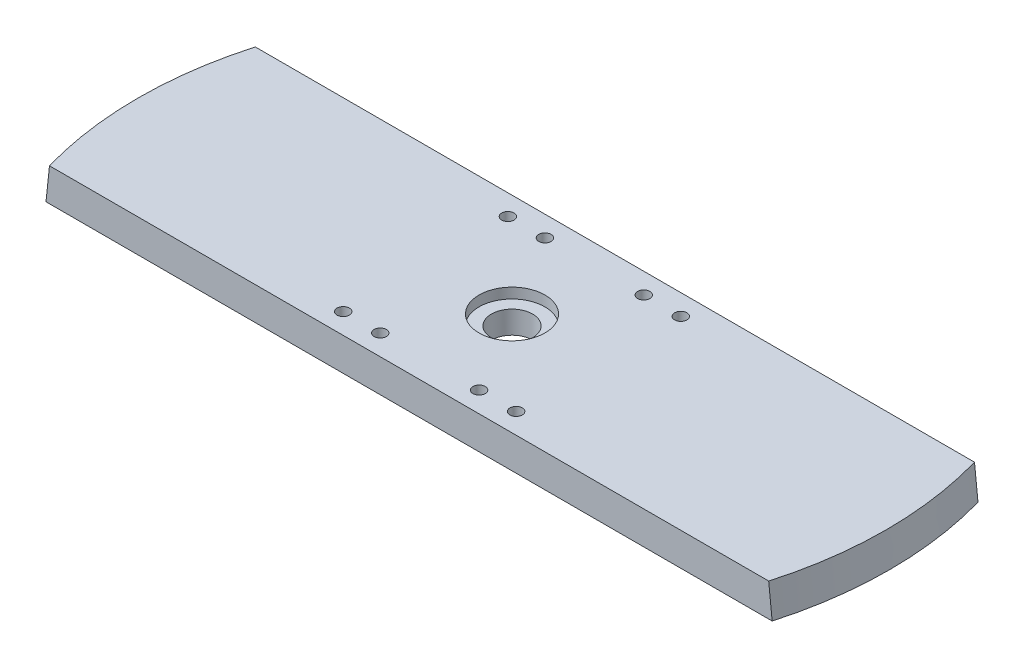
ISO-10303-21;
HEADER;
FILE_DESCRIPTION(('STEP AP214'),'2;1');
FILE_NAME('part.step','',(''),(''),'','','');
FILE_SCHEMA(('AUTOMOTIVE_DESIGN { 1 0 10303 214 1 1 1 1 }'));
ENDSEC;
DATA;
#1=APPLICATION_CONTEXT('core data for automotive mechanical design processes');
#2=APPLICATION_PROTOCOL_DEFINITION('international standard','automotive_design',2000,#1);
#3=PRODUCT_CONTEXT('',#1,'mechanical');
#4=PRODUCT('Part','Part','',(#3));
#5=PRODUCT_RELATED_PRODUCT_CATEGORY('part','',(#4));
#6=PRODUCT_DEFINITION_FORMATION('','',#4);
#7=PRODUCT_DEFINITION_CONTEXT('part definition',#1,'design');
#8=PRODUCT_DEFINITION('design','',#6,#7);
#9=PRODUCT_DEFINITION_SHAPE('','',#8);
#10=(LENGTH_UNIT() NAMED_UNIT(*) SI_UNIT(.MILLI.,.METRE.));
#11=(NAMED_UNIT(*) PLANE_ANGLE_UNIT() SI_UNIT($,.RADIAN.));
#12=(NAMED_UNIT(*) SI_UNIT($,.STERADIAN.) SOLID_ANGLE_UNIT());
#13=UNCERTAINTY_MEASURE_WITH_UNIT(LENGTH_MEASURE(1.E-05),#10,'distance_accuracy_value','');
#14=(GEOMETRIC_REPRESENTATION_CONTEXT(3) GLOBAL_UNCERTAINTY_ASSIGNED_CONTEXT((#13)) GLOBAL_UNIT_ASSIGNED_CONTEXT((#10,
#11,#12)) REPRESENTATION_CONTEXT('',''));
#15=CARTESIAN_POINT('',(0.,0.,0.));
#16=DIRECTION('',(0.,0.,1.));
#17=DIRECTION('',(1.,0.,0.));
#18=AXIS2_PLACEMENT_3D('',#15,#16,#17);
#19=CARTESIAN_POINT('',(0.,22.1421356237309,0.));
#20=DIRECTION('',(0.,-1.,0.));
#21=DIRECTION('',(1.,0.,0.));
#22=AXIS2_PLACEMENT_3D('',#19,#20,#21);
#23=CYLINDRICAL_SURFACE('',#22,5.);
#24=CARTESIAN_POINT('',(0.,0.,0.));
#25=DIRECTION('',(0.,-1.,0.));
#26=DIRECTION('',(1.,0.,0.));
#27=AXIS2_PLACEMENT_3D('',#24,#25,#26);
#28=CIRCLE('',#27,5.);
#29=CARTESIAN_POINT('',(5.,0.,0.));
#30=VERTEX_POINT('',#29);
#31=EDGE_CURVE('E148',#30,#30,#28,.T.);
#32=ORIENTED_EDGE('',*,*,#31,.T.);
#33=EDGE_LOOP('',(#32));
#34=FACE_BOUND('',#33,.T.);
#35=CARTESIAN_POINT('',(0.,5.49999999999999,0.));
#36=DIRECTION('',(0.,1.,0.));
#37=DIRECTION('',(-1.,0.,0.));
#38=AXIS2_PLACEMENT_3D('',#35,#36,#37);
#39=CIRCLE('',#38,5.);
#40=CARTESIAN_POINT('',(-5.,5.49999999999999,0.));
#41=VERTEX_POINT('',#40);
#42=EDGE_CURVE('E39',#41,#41,#39,.F.);
#43=ORIENTED_EDGE('',*,*,#42,.F.);
#44=EDGE_LOOP('',(#43));
#45=FACE_BOUND('',#44,.T.);
#46=ADVANCED_FACE('F35',(#34,#45),#23,.F.);
#47=CARTESIAN_POINT('',(-90.85827256577,7.99999999999998,-25.));
#48=DIRECTION('',(0.,1.,0.));
#49=DIRECTION('',(-1.,0.,0.));
#50=AXIS2_PLACEMENT_3D('',#47,#48,#49);
#51=PLANE('',#50);
#52=CARTESIAN_POINT('',(21.,7.99999999999999,20.));
#53=DIRECTION('',(0.,1.,0.));
#54=DIRECTION('',(-1.,0.,0.));
#55=AXIS2_PLACEMENT_3D('',#52,#53,#54);
#56=CIRCLE('',#55,1.5);
#57=CARTESIAN_POINT('',(19.5,7.99999999999999,20.));
#58=VERTEX_POINT('',#57);
#59=EDGE_CURVE('E210',#58,#58,#56,.T.);
#60=ORIENTED_EDGE('',*,*,#59,.F.);
#61=EDGE_LOOP('',(#60));
#62=FACE_BOUND('',#61,.T.);
#63=CARTESIAN_POINT('',(-21.,7.99999999999999,20.));
#64=DIRECTION('',(0.,1.,0.));
#65=DIRECTION('',(-1.,0.,0.));
#66=AXIS2_PLACEMENT_3D('',#63,#64,#65);
#67=CIRCLE('',#66,1.5);
#68=CARTESIAN_POINT('',(-22.5,7.99999999999999,20.));
#69=VERTEX_POINT('',#68);
#70=EDGE_CURVE('E205',#69,#69,#67,.T.);
#71=ORIENTED_EDGE('',*,*,#70,.F.);
#72=EDGE_LOOP('',(#71));
#73=FACE_BOUND('',#72,.T.);
#74=CARTESIAN_POINT('',(-21.,7.99999999999999,-20.));
#75=DIRECTION('',(0.,1.,0.));
#76=DIRECTION('',(-1.,0.,0.));
#77=AXIS2_PLACEMENT_3D('',#74,#75,#76);
#78=CIRCLE('',#77,1.5);
#79=CARTESIAN_POINT('',(-22.5,7.99999999999999,-20.));
#80=VERTEX_POINT('',#79);
#81=EDGE_CURVE('E199',#80,#80,#78,.T.);
#82=ORIENTED_EDGE('',*,*,#81,.F.);
#83=EDGE_LOOP('',(#82));
#84=FACE_BOUND('',#83,.T.);
#85=CARTESIAN_POINT('',(21.,7.99999999999999,-20.));
#86=DIRECTION('',(0.,1.,0.));
#87=DIRECTION('',(-1.,0.,0.));
#88=AXIS2_PLACEMENT_3D('',#85,#86,#87);
#89=CIRCLE('',#88,1.5);
#90=CARTESIAN_POINT('',(19.5,7.99999999999999,-20.));
#91=VERTEX_POINT('',#90);
#92=EDGE_CURVE('E193',#91,#91,#89,.T.);
#93=ORIENTED_EDGE('',*,*,#92,.F.);
#94=EDGE_LOOP('',(#93));
#95=FACE_BOUND('',#94,.T.);
#96=CARTESIAN_POINT('',(12.,7.99999999999999,20.));
#97=DIRECTION('',(0.,1.,0.));
#98=DIRECTION('',(-1.,0.,0.));
#99=AXIS2_PLACEMENT_3D('',#96,#97,#98);
#100=CIRCLE('',#99,1.5);
#101=CARTESIAN_POINT('',(10.5,7.99999999999999,20.));
#102=VERTEX_POINT('',#101);
#103=EDGE_CURVE('E187',#102,#102,#100,.T.);
#104=ORIENTED_EDGE('',*,*,#103,.F.);
#105=EDGE_LOOP('',(#104));
#106=FACE_BOUND('',#105,.T.);
#107=CARTESIAN_POINT('',(-12.,7.99999999999999,20.));
#108=DIRECTION('',(0.,1.,0.));
#109=DIRECTION('',(-1.,0.,0.));
#110=AXIS2_PLACEMENT_3D('',#107,#108,#109);
#111=CIRCLE('',#110,1.5);
#112=CARTESIAN_POINT('',(-13.5,7.99999999999999,20.));
#113=VERTEX_POINT('',#112);
#114=EDGE_CURVE('E181',#113,#113,#111,.T.);
#115=ORIENTED_EDGE('',*,*,#114,.F.);
#116=EDGE_LOOP('',(#115));
#117=FACE_BOUND('',#116,.T.);
#118=CARTESIAN_POINT('',(-12.,7.99999999999999,-20.));
#119=DIRECTION('',(0.,1.,0.));
#120=DIRECTION('',(-1.,0.,0.));
#121=AXIS2_PLACEMENT_3D('',#118,#119,#120);
#122=CIRCLE('',#121,1.5);
#123=CARTESIAN_POINT('',(-13.5,7.99999999999999,-20.));
#124=VERTEX_POINT('',#123);
#125=EDGE_CURVE('E175',#124,#124,#122,.T.);
#126=ORIENTED_EDGE('',*,*,#125,.F.);
#127=EDGE_LOOP('',(#126));
#128=FACE_BOUND('',#127,.T.);
#129=CARTESIAN_POINT('',(12.,7.99999999999999,-20.));
#130=DIRECTION('',(0.,1.,0.));
#131=DIRECTION('',(-1.,0.,0.));
#132=AXIS2_PLACEMENT_3D('',#129,#130,#131);
#133=CIRCLE('',#132,1.5);
#134=CARTESIAN_POINT('',(10.5,7.99999999999999,-20.));
#135=VERTEX_POINT('',#134);
#136=EDGE_CURVE('E169',#135,#135,#133,.T.);
#137=ORIENTED_EDGE('',*,*,#136,.F.);
#138=EDGE_LOOP('',(#137));
#139=FACE_BOUND('',#138,.T.);
#140=CARTESIAN_POINT('',(0.,7.99999999999999,0.));
#141=DIRECTION('',(0.,1.,0.));
#142=DIRECTION('',(-1.,0.,0.));
#143=AXIS2_PLACEMENT_3D('',#140,#141,#142);
#144=CIRCLE('',#143,8.);
#145=CARTESIAN_POINT('',(-8.,7.99999999999999,0.));
#146=VERTEX_POINT('',#145);
#147=EDGE_CURVE('E156',#146,#146,#144,.T.);
#148=ORIENTED_EDGE('',*,*,#147,.F.);
#149=EDGE_LOOP('',(#148));
#150=FACE_BOUND('',#149,.T.);
#151=CARTESIAN_POINT('',(0.,7.99999999999999,0.));
#152=DIRECTION('',(0.,-1.,0.));
#153=DIRECTION('',(1.,0.,0.));
#154=AXIS2_PLACEMENT_3D('',#151,#152,#153);
#155=CIRCLE('',#154,90.85827256577);
#156=CARTESIAN_POINT('',(87.3511630926329,8.,-25.));
#157=VERTEX_POINT('',#156);
#158=CARTESIAN_POINT('',(87.3511630926329,8.,25.));
#159=VERTEX_POINT('',#158);
#160=EDGE_CURVE('E58',#157,#159,#155,.T.);
#161=ORIENTED_EDGE('',*,*,#160,.F.);
#162=DIRECTION('',(-1.,0.,0.));
#163=VECTOR('',#162,1.);
#164=CARTESIAN_POINT('',(-90.85827256577,7.99999999999998,-25.));
#165=LINE('',#164,#163);
#166=CARTESIAN_POINT('',(-87.3511630926329,7.99999999999998,-25.));
#167=VERTEX_POINT('',#166);
#168=EDGE_CURVE('E82',#157,#167,#165,.T.);
#169=ORIENTED_EDGE('',*,*,#168,.T.);
#170=CARTESIAN_POINT('',(-87.3511630926329,7.99999999999998,25.));
#171=VERTEX_POINT('',#170);
#172=EDGE_CURVE('E78',#171,#167,#155,.T.);
#173=ORIENTED_EDGE('',*,*,#172,.F.);
#174=DIRECTION('',(-1.,0.,0.));
#175=VECTOR('',#174,1.);
#176=CARTESIAN_POINT('',(-90.85827256577,7.99999999999998,25.));
#177=LINE('',#176,#175);
#178=EDGE_CURVE('E80',#159,#171,#177,.T.);
#179=ORIENTED_EDGE('',*,*,#178,.F.);
#180=EDGE_LOOP('',(#161,#169,#173,#179));
#181=FACE_BOUND('',#180,.T.);
#182=ADVANCED_FACE('F37',(#62,#73,#84,#95,#106,#117,#128,#139,#150,#181),#51,.T.);
#183=CARTESIAN_POINT('',(-91.6708829323086,0.,-25.));
#184=DIRECTION('',(0.,-1.,0.));
#185=DIRECTION('',(1.,0.,0.));
#186=AXIS2_PLACEMENT_3D('',#183,#184,#185);
#187=PLANE('',#186);
#188=CARTESIAN_POINT('',(21.,0.,20.));
#189=DIRECTION('',(0.,-1.,0.));
#190=DIRECTION('',(1.,0.,0.));
#191=AXIS2_PLACEMENT_3D('',#188,#189,#190);
#192=CIRCLE('',#191,1.5);
#193=CARTESIAN_POINT('',(22.5,0.,20.));
#194=VERTEX_POINT('',#193);
#195=EDGE_CURVE('E208',#194,#194,#192,.F.);
#196=ORIENTED_EDGE('',*,*,#195,.T.);
#197=EDGE_LOOP('',(#196));
#198=FACE_BOUND('',#197,.T.);
#199=CARTESIAN_POINT('',(-21.,0.,20.));
#200=DIRECTION('',(0.,-1.,0.));
#201=DIRECTION('',(1.,0.,0.));
#202=AXIS2_PLACEMENT_3D('',#199,#200,#201);
#203=CIRCLE('',#202,1.5);
#204=CARTESIAN_POINT('',(-19.5,0.,20.));
#205=VERTEX_POINT('',#204);
#206=EDGE_CURVE('E202',#205,#205,#203,.F.);
#207=ORIENTED_EDGE('',*,*,#206,.T.);
#208=EDGE_LOOP('',(#207));
#209=FACE_BOUND('',#208,.T.);
#210=CARTESIAN_POINT('',(-21.,0.,-20.));
#211=DIRECTION('',(0.,-1.,0.));
#212=DIRECTION('',(1.,0.,0.));
#213=AXIS2_PLACEMENT_3D('',#210,#211,#212);
#214=CIRCLE('',#213,1.5);
#215=CARTESIAN_POINT('',(-19.5,0.,-20.));
#216=VERTEX_POINT('',#215);
#217=EDGE_CURVE('E196',#216,#216,#214,.F.);
#218=ORIENTED_EDGE('',*,*,#217,.T.);
#219=EDGE_LOOP('',(#218));
#220=FACE_BOUND('',#219,.T.);
#221=CARTESIAN_POINT('',(21.,0.,-20.));
#222=DIRECTION('',(0.,-1.,0.));
#223=DIRECTION('',(1.,0.,0.));
#224=AXIS2_PLACEMENT_3D('',#221,#222,#223);
#225=CIRCLE('',#224,1.5);
#226=CARTESIAN_POINT('',(22.5,0.,-20.));
#227=VERTEX_POINT('',#226);
#228=EDGE_CURVE('E190',#227,#227,#225,.F.);
#229=ORIENTED_EDGE('',*,*,#228,.T.);
#230=EDGE_LOOP('',(#229));
#231=FACE_BOUND('',#230,.T.);
#232=CARTESIAN_POINT('',(12.,0.,20.));
#233=DIRECTION('',(0.,-1.,0.));
#234=DIRECTION('',(1.,0.,0.));
#235=AXIS2_PLACEMENT_3D('',#232,#233,#234);
#236=CIRCLE('',#235,1.5);
#237=CARTESIAN_POINT('',(13.5,0.,20.));
#238=VERTEX_POINT('',#237);
#239=EDGE_CURVE('E184',#238,#238,#236,.F.);
#240=ORIENTED_EDGE('',*,*,#239,.T.);
#241=EDGE_LOOP('',(#240));
#242=FACE_BOUND('',#241,.T.);
#243=CARTESIAN_POINT('',(-12.,0.,20.));
#244=DIRECTION('',(0.,-1.,0.));
#245=DIRECTION('',(1.,0.,0.));
#246=AXIS2_PLACEMENT_3D('',#243,#244,#245);
#247=CIRCLE('',#246,1.5);
#248=CARTESIAN_POINT('',(-10.5,0.,20.));
#249=VERTEX_POINT('',#248);
#250=EDGE_CURVE('E178',#249,#249,#247,.F.);
#251=ORIENTED_EDGE('',*,*,#250,.T.);
#252=EDGE_LOOP('',(#251));
#253=FACE_BOUND('',#252,.T.);
#254=CARTESIAN_POINT('',(-12.,0.,-20.));
#255=DIRECTION('',(0.,-1.,0.));
#256=DIRECTION('',(1.,0.,0.));
#257=AXIS2_PLACEMENT_3D('',#254,#255,#256);
#258=CIRCLE('',#257,1.5);
#259=CARTESIAN_POINT('',(-10.5,0.,-20.));
#260=VERTEX_POINT('',#259);
#261=EDGE_CURVE('E172',#260,#260,#258,.F.);
#262=ORIENTED_EDGE('',*,*,#261,.T.);
#263=EDGE_LOOP('',(#262));
#264=FACE_BOUND('',#263,.T.);
#265=CARTESIAN_POINT('',(12.,0.,-20.));
#266=DIRECTION('',(0.,-1.,0.));
#267=DIRECTION('',(1.,0.,0.));
#268=AXIS2_PLACEMENT_3D('',#265,#266,#267);
#269=CIRCLE('',#268,1.5);
#270=CARTESIAN_POINT('',(13.5,0.,-20.));
#271=VERTEX_POINT('',#270);
#272=EDGE_CURVE('E161',#271,#271,#269,.F.);
#273=ORIENTED_EDGE('',*,*,#272,.T.);
#274=EDGE_LOOP('',(#273));
#275=FACE_BOUND('',#274,.T.);
#276=ORIENTED_EDGE('',*,*,#31,.F.);
#277=EDGE_LOOP('',(#276));
#278=FACE_BOUND('',#277,.T.);
#279=CARTESIAN_POINT('',(0.,0.,0.));
#280=DIRECTION('',(0.,-1.,0.));
#281=DIRECTION('',(1.,0.,0.));
#282=AXIS2_PLACEMENT_3D('',#279,#280,#281);
#283=CIRCLE('',#282,91.6708829323086);
#284=CARTESIAN_POINT('',(-88.1960927569302,0.,25.));
#285=VERTEX_POINT('',#284);
#286=CARTESIAN_POINT('',(-88.1960927569302,0.,-25.));
#287=VERTEX_POINT('',#286);
#288=EDGE_CURVE('E51',#285,#287,#283,.T.);
#289=ORIENTED_EDGE('',*,*,#288,.T.);
#290=DIRECTION('',(1.,0.,0.));
#291=VECTOR('',#290,1.);
#292=CARTESIAN_POINT('',(-91.6708829323086,0.,-25.));
#293=LINE('',#292,#291);
#294=CARTESIAN_POINT('',(88.1960927569302,0.,-25.));
#295=VERTEX_POINT('',#294);
#296=EDGE_CURVE('E104',#287,#295,#293,.T.);
#297=ORIENTED_EDGE('',*,*,#296,.T.);
#298=CARTESIAN_POINT('',(88.1960927569302,0.,25.));
#299=VERTEX_POINT('',#298);
#300=EDGE_CURVE('E153',#295,#299,#283,.T.);
#301=ORIENTED_EDGE('',*,*,#300,.T.);
#302=DIRECTION('',(1.,0.,0.));
#303=VECTOR('',#302,1.);
#304=CARTESIAN_POINT('',(-91.6708829323086,0.,25.));
#305=LINE('',#304,#303);
#306=EDGE_CURVE('E91',#285,#299,#305,.T.);
#307=ORIENTED_EDGE('',*,*,#306,.F.);
#308=EDGE_LOOP('',(#289,#297,#301,#307));
#309=FACE_BOUND('',#308,.T.);
#310=ADVANCED_FACE('F130',(#198,#209,#220,#231,#242,#253,#264,#275,#278,#309),#187,.T.);
#311=CARTESIAN_POINT('',(0.,0.,-25.));
#312=DIRECTION('',(0.,0.,-1.));
#313=DIRECTION('',(-1.,0.,0.));
#314=AXIS2_PLACEMENT_3D('',#311,#312,#313);
#315=PLANE('',#314);
#316=CARTESIAN_POINT('',(-70.0230995800675,170.500260988647,-25.));
#317=CARTESIAN_POINT('',(-71.229951890009,159.310482140328,-25.));
#318=CARTESIAN_POINT('',(-72.4333814814405,148.120334651438,-25.));
#319=CARTESIAN_POINT('',(-74.8342268378172,125.739395176884,-25.));
#320=CARTESIAN_POINT('',(-76.0316426031307,114.54860319126,-25.));
#321=CARTESIAN_POINT('',(-78.4212917064185,92.1664694995342,-25.));
#322=CARTESIAN_POINT('',(-79.6135250459499,80.9751277935983,-25.));
#323=CARTESIAN_POINT('',(-81.9934574590972,58.591962238947,-25.));
#324=CARTESIAN_POINT('',(-83.1811565326873,47.4001383902288,-25.));
#325=CARTESIAN_POINT('',(-84.8996979507838,31.1786149738283,-25.));
#326=CARTESIAN_POINT('',(-85.4321300094297,26.1490837579759,-25.));
#327=CARTESIAN_POINT('',(-86.4962320201821,16.0899405593841,-25.));
#328=CARTESIAN_POINT('',(-87.0279019722668,11.0603285766424,-25.));
#329=CARTESIAN_POINT('',(-89.0071821889221,-7.67653682474717,-25.));
#330=CARTESIAN_POINT('',(-90.4524799369088,-21.3840345738612,-25.));
#331=CARTESIAN_POINT('',(-93.3384529322146,-48.799516876959,-25.));
#332=CARTESIAN_POINT('',(-94.7791281794234,-62.5075014309543,-25.));
#333=CARTESIAN_POINT('',(-97.6564534035838,-89.9238917920457,-25.));
#334=CARTESIAN_POINT('',(-99.0931033808667,-103.632297599107,-25.));
#335=CARTESIAN_POINT('',(-101.962856879167,-131.049479746363,-25.));
#336=CARTESIAN_POINT('',(-103.395960400363,-144.758256086539,-25.));
#337=CARTESIAN_POINT('',(-104.827530112961,-158.467192456433,-25.));
#338=B_SPLINE_CURVE_WITH_KNOTS('',3,(#316,#317,#318,#319,#320,#321,#322,#323,#324,#325,#326,
#327,#328,#329,#330,#331,#332,#333,#334,#335,#336,#337),.UNSPECIFIED.,.F.,.F.,(4,2,2,2,2,2,2,2,
2,2,4),(0.,33.7640149186291,67.52802776997,101.292030477394,135.056033377685,150.228937252567,
165.401841563996,206.752286977218,248.102733376309,289.453176371078,330.803617292368),.UNSPECIFIED.);
#339=EDGE_CURVE('E92',#167,#287,#338,.T.);
#340=ORIENTED_EDGE('',*,*,#339,.F.);
#341=ORIENTED_EDGE('',*,*,#168,.F.);
#342=CARTESIAN_POINT('',(104.827530112961,-158.467192456433,-25.));
#343=CARTESIAN_POINT('',(103.395959910584,-144.758250662989,-25.));
#344=CARTESIAN_POINT('',(101.962855785584,-131.049468918686,-25.));
#345=CARTESIAN_POINT('',(99.0931011213006,-103.632276391441,-25.));
#346=CARTESIAN_POINT('',(97.65645058195,-89.923865608507,-25.));
#347=CARTESIAN_POINT('',(94.779125536142,-62.5074755529588,-25.));
#348=CARTESIAN_POINT('',(93.3384510323763,-48.7994962800621,-25.));
#349=CARTESIAN_POINT('',(90.4524786038421,-21.3840244596008,-25.));
#350=CARTESIAN_POINT('',(89.0071806791051,-7.67653191203281,-25.));
#351=CARTESIAN_POINT('',(86.1112429933059,19.7378944558156,-25.));
#352=CARTESIAN_POINT('',(84.6606032301445,33.4448282758744,-25.));
#353=CARTESIAN_POINT('',(81.7531016770458,60.8580356428936,-25.));
#354=CARTESIAN_POINT('',(80.2962398873182,74.5643091898764,-25.));
#355=CARTESIAN_POINT('',(77.3752063248084,101.976086811931,-25.));
#356=CARTESIAN_POINT('',(75.9110345472027,115.681590886489,-25.));
#357=CARTESIAN_POINT('',(73.708264127086,136.23914990699,-25.));
#358=CARTESIAN_POINT('',(72.9729218157339,143.09155382252,-25.));
#359=CARTESIAN_POINT('',(71.4998525801134,156.796105489496,-25.));
#360=CARTESIAN_POINT('',(70.7621256557883,163.648253240937,-25.));
#361=CARTESIAN_POINT('',(70.0230995800674,170.500260988647,-25.));
#362=B_SPLINE_CURVE_WITH_KNOTS('',3,(#342,#343,#344,#345,#346,#347,#348,#349,#350,#351,#352,
#353,#354,#355,#356,#357,#358,#359,#360,#361),.UNSPECIFIED.,.F.,.F.,(4,2,2,2,2,2,2,2,2,4),(0.,
41.3504572416029,82.7009152658658,124.051345638335,165.401775728373,206.752222068012,
248.102667013738,289.453139247749,310.128377922999,330.803617089686),.UNSPECIFIED.);
#363=EDGE_CURVE('E84',#295,#157,#362,.T.);
#364=ORIENTED_EDGE('',*,*,#363,.F.);
#365=ORIENTED_EDGE('',*,*,#296,.F.);
#366=EDGE_LOOP('',(#340,#341,#364,#365));
#367=FACE_BOUND('',#366,.T.);
#368=ADVANCED_FACE('F127',(#367),#315,.T.);
#369=CARTESIAN_POINT('',(0.,0.,25.));
#370=DIRECTION('',(0.,0.,-1.));
#371=DIRECTION('',(-1.,0.,0.));
#372=AXIS2_PLACEMENT_3D('',#369,#370,#371);
#373=PLANE('',#372);
#374=ORIENTED_EDGE('',*,*,#178,.T.);
#375=CARTESIAN_POINT('',(-70.0230995800675,170.500260988647,25.));
#376=CARTESIAN_POINT('',(-71.229951890009,159.310482140328,25.));
#377=CARTESIAN_POINT('',(-72.4333814814405,148.120334651438,25.));
#378=CARTESIAN_POINT('',(-74.8342268378172,125.739395176884,25.));
#379=CARTESIAN_POINT('',(-76.0316426031307,114.54860319126,25.));
#380=CARTESIAN_POINT('',(-78.4212917064185,92.1664694995342,25.));
#381=CARTESIAN_POINT('',(-79.6135250459499,80.9751277935983,25.));
#382=CARTESIAN_POINT('',(-81.9934574590972,58.591962238947,25.));
#383=CARTESIAN_POINT('',(-83.1811565326873,47.4001383902288,25.));
#384=CARTESIAN_POINT('',(-84.8996979507838,31.1786149738283,25.));
#385=CARTESIAN_POINT('',(-85.4321300094297,26.1490837579759,25.));
#386=CARTESIAN_POINT('',(-86.4962320201821,16.0899405593841,25.));
#387=CARTESIAN_POINT('',(-87.0279019722668,11.0603285766424,25.));
#388=CARTESIAN_POINT('',(-89.0071821889221,-7.67653682474717,25.));
#389=CARTESIAN_POINT('',(-90.4524799369088,-21.3840345738612,25.));
#390=CARTESIAN_POINT('',(-93.3384529322146,-48.799516876959,25.));
#391=CARTESIAN_POINT('',(-94.7791281794234,-62.5075014309543,25.));
#392=CARTESIAN_POINT('',(-97.6564534035838,-89.9238917920457,25.));
#393=CARTESIAN_POINT('',(-99.0931033808667,-103.632297599107,25.));
#394=CARTESIAN_POINT('',(-101.962856879167,-131.049479746363,25.));
#395=CARTESIAN_POINT('',(-103.395960400363,-144.758256086539,25.));
#396=CARTESIAN_POINT('',(-104.827530112961,-158.467192456433,25.));
#397=B_SPLINE_CURVE_WITH_KNOTS('',3,(#375,#376,#377,#378,#379,#380,#381,#382,#383,#384,#385,
#386,#387,#388,#389,#390,#391,#392,#393,#394,#395,#396),.UNSPECIFIED.,.F.,.F.,(4,2,2,2,2,2,2,2,
2,2,4),(0.,33.7640149186291,67.52802776997,101.292030477394,135.056033377685,150.228937252567,
165.401841563996,206.752286977218,248.102733376309,289.453176371078,330.803617292368),.UNSPECIFIED.);
#398=EDGE_CURVE('E11',#171,#285,#397,.T.);
#399=ORIENTED_EDGE('',*,*,#398,.T.);
#400=ORIENTED_EDGE('',*,*,#306,.T.);
#401=CARTESIAN_POINT('',(104.827530112961,-158.467192456433,25.));
#402=CARTESIAN_POINT('',(103.395959910584,-144.758250662989,25.));
#403=CARTESIAN_POINT('',(101.962855785584,-131.049468918686,25.));
#404=CARTESIAN_POINT('',(99.0931011213006,-103.632276391441,25.));
#405=CARTESIAN_POINT('',(97.65645058195,-89.923865608507,25.));
#406=CARTESIAN_POINT('',(94.779125536142,-62.5074755529588,25.));
#407=CARTESIAN_POINT('',(93.3384510323763,-48.7994962800621,25.));
#408=CARTESIAN_POINT('',(90.4524786038421,-21.3840244596008,25.));
#409=CARTESIAN_POINT('',(89.0071806791051,-7.67653191203281,25.));
#410=CARTESIAN_POINT('',(86.1112429933059,19.7378944558156,25.));
#411=CARTESIAN_POINT('',(84.6606032301445,33.4448282758744,25.));
#412=CARTESIAN_POINT('',(81.7531016770458,60.8580356428936,25.));
#413=CARTESIAN_POINT('',(80.2962398873182,74.5643091898764,25.));
#414=CARTESIAN_POINT('',(77.3752063248084,101.976086811931,25.));
#415=CARTESIAN_POINT('',(75.9110345472027,115.681590886489,25.));
#416=CARTESIAN_POINT('',(73.708264127086,136.23914990699,25.));
#417=CARTESIAN_POINT('',(72.9729218157339,143.09155382252,25.));
#418=CARTESIAN_POINT('',(71.4998525801134,156.796105489496,25.));
#419=CARTESIAN_POINT('',(70.7621256557883,163.648253240937,25.));
#420=CARTESIAN_POINT('',(70.0230995800674,170.500260988647,25.));
#421=B_SPLINE_CURVE_WITH_KNOTS('',3,(#401,#402,#403,#404,#405,#406,#407,#408,#409,#410,#411,
#412,#413,#414,#415,#416,#417,#418,#419,#420),.UNSPECIFIED.,.F.,.F.,(4,2,2,2,2,2,2,2,2,4),(0.,
41.3504572416029,82.7009152658658,124.051345638335,165.401775728373,206.752222068012,
248.102667013738,289.453139247749,310.128377922999,330.803617089686),.UNSPECIFIED.);
#422=EDGE_CURVE('E44',#299,#159,#421,.T.);
#423=ORIENTED_EDGE('',*,*,#422,.T.);
#424=EDGE_LOOP('',(#374,#399,#400,#423));
#425=FACE_BOUND('',#424,.T.);
#426=ADVANCED_FACE('F90',(#425),#373,.F.);
#427=CARTESIAN_POINT('',(0.,7.99999999999999,0.));
#428=DIRECTION('',(0.,-1.,0.));
#429=DIRECTION('',(1.,0.,0.));
#430=AXIS2_PLACEMENT_3D('',#427,#428,#429);
#431=CONICAL_SURFACE('',#430,90.85827256577,0.101229096615666);
#432=ORIENTED_EDGE('',*,*,#300,.F.);
#433=ORIENTED_EDGE('',*,*,#363,.T.);
#434=ORIENTED_EDGE('',*,*,#160,.T.);
#435=ORIENTED_EDGE('',*,*,#422,.F.);
#436=EDGE_LOOP('',(#432,#433,#434,#435));
#437=FACE_BOUND('',#436,.T.);
#438=ADVANCED_FACE('F115',(#437),#431,.T.);
#439=ORIENTED_EDGE('',*,*,#288,.F.);
#440=ORIENTED_EDGE('',*,*,#398,.F.);
#441=ORIENTED_EDGE('',*,*,#172,.T.);
#442=ORIENTED_EDGE('',*,*,#339,.T.);
#443=EDGE_LOOP('',(#439,#440,#441,#442));
#444=FACE_BOUND('',#443,.T.);
#445=ADVANCED_FACE('F86',(#444),#431,.T.);
#446=CARTESIAN_POINT('',(0.,5.49999999999999,0.));
#447=DIRECTION('',(0.,1.,0.));
#448=DIRECTION('',(-1.,0.,0.));
#449=AXIS2_PLACEMENT_3D('',#446,#447,#448);
#450=PLANE('',#449);
#451=CARTESIAN_POINT('',(0.,5.49999999999999,0.));
#452=DIRECTION('',(0.,1.,0.));
#453=DIRECTION('',(-1.,0.,0.));
#454=AXIS2_PLACEMENT_3D('',#451,#452,#453);
#455=CIRCLE('',#454,8.);
#456=CARTESIAN_POINT('',(-8.,5.49999999999999,0.));
#457=VERTEX_POINT('',#456);
#458=EDGE_CURVE('E152',#457,#457,#455,.T.);
#459=ORIENTED_EDGE('',*,*,#458,.T.);
#460=EDGE_LOOP('',(#459));
#461=FACE_BOUND('',#460,.T.);
#462=ORIENTED_EDGE('',*,*,#42,.T.);
#463=EDGE_LOOP('',(#462));
#464=FACE_BOUND('',#463,.T.);
#465=ADVANCED_FACE('F236',(#461,#464),#450,.T.);
#466=CARTESIAN_POINT('',(0.,5.49999999999999,0.));
#467=DIRECTION('',(0.,1.,0.));
#468=DIRECTION('',(-1.,0.,0.));
#469=AXIS2_PLACEMENT_3D('',#466,#467,#468);
#470=CYLINDRICAL_SURFACE('',#469,8.);
#471=ORIENTED_EDGE('',*,*,#458,.F.);
#472=EDGE_LOOP('',(#471));
#473=FACE_BOUND('',#472,.T.);
#474=ORIENTED_EDGE('',*,*,#147,.T.);
#475=EDGE_LOOP('',(#474));
#476=FACE_BOUND('',#475,.T.);
#477=ADVANCED_FACE('F233',(#473,#476),#470,.F.);
#478=CARTESIAN_POINT('',(12.,-4.2426406871193,-20.));
#479=DIRECTION('',(0.,1.,0.));
#480=DIRECTION('',(-1.,0.,0.));
#481=AXIS2_PLACEMENT_3D('',#478,#479,#480);
#482=CYLINDRICAL_SURFACE('',#481,1.5);
#483=ORIENTED_EDGE('',*,*,#136,.T.);
#484=EDGE_LOOP('',(#483));
#485=FACE_BOUND('',#484,.T.);
#486=ORIENTED_EDGE('',*,*,#272,.F.);
#487=EDGE_LOOP('',(#486));
#488=FACE_BOUND('',#487,.T.);
#489=ADVANCED_FACE('F235',(#485,#488),#482,.F.);
#490=CARTESIAN_POINT('',(-12.,-4.2426406871193,-20.));
#491=DIRECTION('',(0.,1.,0.));
#492=DIRECTION('',(-1.,0.,0.));
#493=AXIS2_PLACEMENT_3D('',#490,#491,#492);
#494=CYLINDRICAL_SURFACE('',#493,1.5);
#495=ORIENTED_EDGE('',*,*,#125,.T.);
#496=EDGE_LOOP('',(#495));
#497=FACE_BOUND('',#496,.T.);
#498=ORIENTED_EDGE('',*,*,#261,.F.);
#499=EDGE_LOOP('',(#498));
#500=FACE_BOUND('',#499,.T.);
#501=ADVANCED_FACE('F242',(#497,#500),#494,.F.);
#502=CARTESIAN_POINT('',(-12.,-4.2426406871193,20.));
#503=DIRECTION('',(0.,1.,0.));
#504=DIRECTION('',(-1.,0.,0.));
#505=AXIS2_PLACEMENT_3D('',#502,#503,#504);
#506=CYLINDRICAL_SURFACE('',#505,1.5);
#507=ORIENTED_EDGE('',*,*,#114,.T.);
#508=EDGE_LOOP('',(#507));
#509=FACE_BOUND('',#508,.T.);
#510=ORIENTED_EDGE('',*,*,#250,.F.);
#511=EDGE_LOOP('',(#510));
#512=FACE_BOUND('',#511,.T.);
#513=ADVANCED_FACE('F249',(#509,#512),#506,.F.);
#514=CARTESIAN_POINT('',(12.,-4.2426406871193,20.));
#515=DIRECTION('',(0.,1.,0.));
#516=DIRECTION('',(-1.,0.,0.));
#517=AXIS2_PLACEMENT_3D('',#514,#515,#516);
#518=CYLINDRICAL_SURFACE('',#517,1.5);
#519=ORIENTED_EDGE('',*,*,#103,.T.);
#520=EDGE_LOOP('',(#519));
#521=FACE_BOUND('',#520,.T.);
#522=ORIENTED_EDGE('',*,*,#239,.F.);
#523=EDGE_LOOP('',(#522));
#524=FACE_BOUND('',#523,.T.);
#525=ADVANCED_FACE('F253',(#521,#524),#518,.F.);
#526=CARTESIAN_POINT('',(21.,-4.2426406871193,-20.));
#527=DIRECTION('',(0.,1.,0.));
#528=DIRECTION('',(-1.,0.,0.));
#529=AXIS2_PLACEMENT_3D('',#526,#527,#528);
#530=CYLINDRICAL_SURFACE('',#529,1.5);
#531=ORIENTED_EDGE('',*,*,#92,.T.);
#532=EDGE_LOOP('',(#531));
#533=FACE_BOUND('',#532,.T.);
#534=ORIENTED_EDGE('',*,*,#228,.F.);
#535=EDGE_LOOP('',(#534));
#536=FACE_BOUND('',#535,.T.);
#537=ADVANCED_FACE('F257',(#533,#536),#530,.F.);
#538=CARTESIAN_POINT('',(-21.,-4.2426406871193,-20.));
#539=DIRECTION('',(0.,1.,0.));
#540=DIRECTION('',(-1.,0.,0.));
#541=AXIS2_PLACEMENT_3D('',#538,#539,#540);
#542=CYLINDRICAL_SURFACE('',#541,1.5);
#543=ORIENTED_EDGE('',*,*,#81,.T.);
#544=EDGE_LOOP('',(#543));
#545=FACE_BOUND('',#544,.T.);
#546=ORIENTED_EDGE('',*,*,#217,.F.);
#547=EDGE_LOOP('',(#546));
#548=FACE_BOUND('',#547,.T.);
#549=ADVANCED_FACE('F261',(#545,#548),#542,.F.);
#550=CARTESIAN_POINT('',(-21.,-4.2426406871193,20.));
#551=DIRECTION('',(0.,1.,0.));
#552=DIRECTION('',(-1.,0.,0.));
#553=AXIS2_PLACEMENT_3D('',#550,#551,#552);
#554=CYLINDRICAL_SURFACE('',#553,1.5);
#555=ORIENTED_EDGE('',*,*,#70,.T.);
#556=EDGE_LOOP('',(#555));
#557=FACE_BOUND('',#556,.T.);
#558=ORIENTED_EDGE('',*,*,#206,.F.);
#559=EDGE_LOOP('',(#558));
#560=FACE_BOUND('',#559,.T.);
#561=ADVANCED_FACE('F265',(#557,#560),#554,.F.);
#562=CARTESIAN_POINT('',(21.,-4.2426406871193,20.));
#563=DIRECTION('',(0.,1.,0.));
#564=DIRECTION('',(-1.,0.,0.));
#565=AXIS2_PLACEMENT_3D('',#562,#563,#564);
#566=CYLINDRICAL_SURFACE('',#565,1.5);
#567=ORIENTED_EDGE('',*,*,#59,.T.);
#568=EDGE_LOOP('',(#567));
#569=FACE_BOUND('',#568,.T.);
#570=ORIENTED_EDGE('',*,*,#195,.F.);
#571=EDGE_LOOP('',(#570));
#572=FACE_BOUND('',#571,.T.);
#573=ADVANCED_FACE('F214',(#569,#572),#566,.F.);
#574=CLOSED_SHELL('',(#46,#182,#310,#368,#426,#438,#445,#465,#477,#489,#501,#513,#525,#537,#549,
#561,#573));
#575=MANIFOLD_SOLID_BREP('B2',#574);
#576=ADVANCED_BREP_SHAPE_REPRESENTATION('',(#18,#575),#14);
#577=SHAPE_DEFINITION_REPRESENTATION(#9,#576);
ENDSEC;
END-ISO-10303-21;
